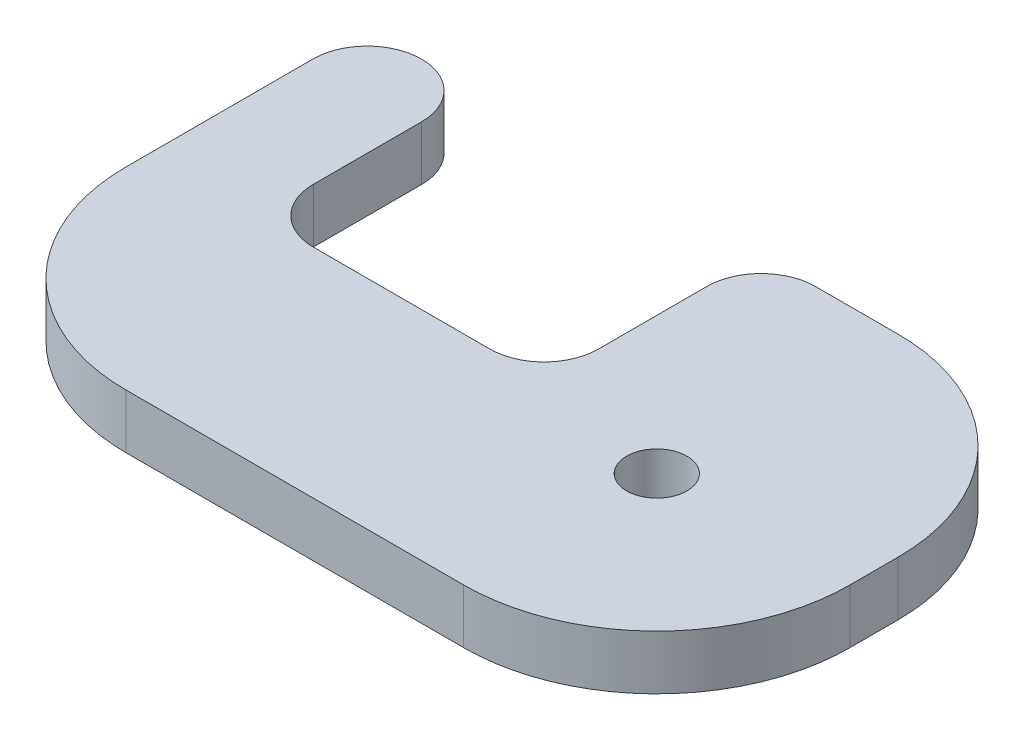
ISO-10303-21;
HEADER;
FILE_DESCRIPTION(('STEP AP214'),'2;1');
FILE_NAME('part.step','',(''),(''),'','','');
FILE_SCHEMA(('AUTOMOTIVE_DESIGN { 1 0 10303 214 1 1 1 1 }'));
ENDSEC;
DATA;
#1=APPLICATION_CONTEXT('core data for automotive mechanical design processes');
#2=APPLICATION_PROTOCOL_DEFINITION('international standard','automotive_design',2000,#1);
#3=PRODUCT_CONTEXT('',#1,'mechanical');
#4=PRODUCT('Part','Part','',(#3));
#5=PRODUCT_RELATED_PRODUCT_CATEGORY('part','',(#4));
#6=PRODUCT_DEFINITION_FORMATION('','',#4);
#7=PRODUCT_DEFINITION_CONTEXT('part definition',#1,'design');
#8=PRODUCT_DEFINITION('design','',#6,#7);
#9=PRODUCT_DEFINITION_SHAPE('','',#8);
#10=(LENGTH_UNIT() NAMED_UNIT(*) SI_UNIT(.MILLI.,.METRE.));
#11=(NAMED_UNIT(*) PLANE_ANGLE_UNIT() SI_UNIT($,.RADIAN.));
#12=(NAMED_UNIT(*) SI_UNIT($,.STERADIAN.) SOLID_ANGLE_UNIT());
#13=UNCERTAINTY_MEASURE_WITH_UNIT(LENGTH_MEASURE(1.E-05),#10,'distance_accuracy_value','');
#14=(GEOMETRIC_REPRESENTATION_CONTEXT(3) GLOBAL_UNCERTAINTY_ASSIGNED_CONTEXT((#13)) GLOBAL_UNIT_ASSIGNED_CONTEXT((#10,
#11,#12)) REPRESENTATION_CONTEXT('',''));
#15=CARTESIAN_POINT('',(0.,0.,0.));
#16=DIRECTION('',(0.,0.,1.));
#17=DIRECTION('',(1.,0.,0.));
#18=AXIS2_PLACEMENT_3D('',#15,#16,#17);
#19=CARTESIAN_POINT('',(0.0610509357311137,3.175,0.0294105912709789));
#20=DIRECTION('',(0.,1.,0.));
#21=DIRECTION('',(0.,0.,1.));
#22=AXIS2_PLACEMENT_3D('',#19,#20,#21);
#23=PLANE('',#22);
#24=CARTESIAN_POINT('',(9.92895093573112,3.175,1.43911059127098));
#25=DIRECTION('',(0.,1.,0.));
#26=DIRECTION('',(0.,0.,1.));
#27=AXIS2_PLACEMENT_3D('',#24,#25,#26);
#28=CIRCLE('',#27,1.762125);
#29=CARTESIAN_POINT('',(9.92895093573112,3.175,3.20123559127098));
#30=VERTEX_POINT('',#29);
#31=EDGE_CURVE('E201',#30,#30,#28,.T.);
#32=ORIENTED_EDGE('',*,*,#31,.F.);
#33=EDGE_LOOP('',(#32));
#34=FACE_BOUND('',#33,.T.);
#35=DIRECTION('',(-1.,0.,0.));
#36=VECTOR('',#35,1.);
#37=CARTESIAN_POINT('',(-21.0844490642689,3.175,-12.657889408729));
#38=LINE('',#37,#36);
#39=CARTESIAN_POINT('',(9.92895093573111,3.175,-12.657889408729));
#40=VERTEX_POINT('',#39);
#41=CARTESIAN_POINT('',(5.10295332629431,3.175,-12.657889408729));
#42=VERTEX_POINT('',#41);
#43=EDGE_CURVE('E197',#40,#42,#38,.T.);
#44=ORIENTED_EDGE('',*,*,#43,.T.);
#45=CARTESIAN_POINT('',(5.10295332629431,3.175,-9.48288940872902));
#46=DIRECTION('',(0.,1.,0.));
#47=DIRECTION('',(0.,0.,1.));
#48=AXIS2_PLACEMENT_3D('',#45,#46,#47);
#49=CIRCLE('',#48,3.175);
#50=CARTESIAN_POINT('',(1.92795332629431,3.175,-9.48288940872902));
#51=VERTEX_POINT('',#50);
#52=EDGE_CURVE('E246',#42,#51,#49,.T.);
#53=ORIENTED_EDGE('',*,*,#52,.T.);
#54=DIRECTION('',(0.,0.,-1.));
#55=VECTOR('',#54,1.);
#56=CARTESIAN_POINT('',(1.92795332629431,3.175,0.0167105912709797));
#57=LINE('',#56,#55);
#58=CARTESIAN_POINT('',(1.92795332629431,3.175,-3.15828940872902));
#59=VERTEX_POINT('',#58);
#60=EDGE_CURVE('E263',#59,#51,#57,.T.);
#61=ORIENTED_EDGE('',*,*,#60,.F.);
#62=CARTESIAN_POINT('',(-1.24704667370569,3.175,-3.15828940872902));
#63=DIRECTION('',(0.,1.,0.));
#64=DIRECTION('',(0.,0.,1.));
#65=AXIS2_PLACEMENT_3D('',#62,#63,#64);
#66=CIRCLE('',#65,3.175);
#67=CARTESIAN_POINT('',(-1.24704667370569,3.175,0.0167105912709797));
#68=VERTEX_POINT('',#67);
#69=EDGE_CURVE('E43',#59,#68,#66,.F.);
#70=ORIENTED_EDGE('',*,*,#69,.T.);
#71=DIRECTION('',(1.,0.,0.));
#72=VECTOR('',#71,1.);
#73=CARTESIAN_POINT('',(-14.7344490642689,3.175,0.0167105912709797));
#74=LINE('',#73,#72);
#75=CARTESIAN_POINT('',(-11.5594490642689,3.175,0.0167105912709797));
#76=VERTEX_POINT('',#75);
#77=EDGE_CURVE('E261',#76,#68,#74,.T.);
#78=ORIENTED_EDGE('',*,*,#77,.F.);
#79=CARTESIAN_POINT('',(-11.5594490642689,3.175,-3.15828940872902));
#80=DIRECTION('',(0.,1.,0.));
#81=DIRECTION('',(0.,0.,1.));
#82=AXIS2_PLACEMENT_3D('',#79,#80,#81);
#83=CIRCLE('',#82,3.175);
#84=CARTESIAN_POINT('',(-14.7344490642689,3.175,-3.15828940872902));
#85=VERTEX_POINT('',#84);
#86=EDGE_CURVE('E254',#76,#85,#83,.F.);
#87=ORIENTED_EDGE('',*,*,#86,.T.);
#88=DIRECTION('',(0.,0.,-1.));
#89=VECTOR('',#88,1.);
#90=CARTESIAN_POINT('',(-14.7344490642689,3.175,0.0167105912709797));
#91=LINE('',#90,#89);
#92=CARTESIAN_POINT('',(-14.7344490642689,3.175,-9.48288940872902));
#93=VERTEX_POINT('',#92);
#94=EDGE_CURVE('E290',#85,#93,#91,.T.);
#95=ORIENTED_EDGE('',*,*,#94,.T.);
#96=CARTESIAN_POINT('',(-17.9094490642689,3.175,-9.48288940872902));
#97=DIRECTION('',(0.,1.,0.));
#98=DIRECTION('',(0.,0.,1.));
#99=AXIS2_PLACEMENT_3D('',#96,#97,#98);
#100=CIRCLE('',#99,3.175);
#101=CARTESIAN_POINT('',(-17.9094490642689,3.175,-12.657889408729));
#102=VERTEX_POINT('',#101);
#103=EDGE_CURVE('E244',#93,#102,#100,.T.);
#104=ORIENTED_EDGE('',*,*,#103,.T.);
#105=CARTESIAN_POINT('',(-17.9094490642689,3.175,-9.48288940872902));
#106=DIRECTION('',(0.,1.,0.));
#107=DIRECTION('',(0.,0.,1.));
#108=AXIS2_PLACEMENT_3D('',#105,#106,#107);
#109=CIRCLE('',#108,3.175);
#110=CARTESIAN_POINT('',(-21.0844490642689,3.175,-9.48288940872902));
#111=VERTEX_POINT('',#110);
#112=EDGE_CURVE('E148',#102,#111,#109,.T.);
#113=ORIENTED_EDGE('',*,*,#112,.T.);
#114=DIRECTION('',(0.,0.,1.));
#115=VECTOR('',#114,1.);
#116=CARTESIAN_POINT('',(-21.0844490642689,3.175,-12.657889408729));
#117=LINE('',#116,#115);
#118=CARTESIAN_POINT('',(-21.0844490642689,3.175,1.43911059127098));
#119=VERTEX_POINT('',#118);
#120=EDGE_CURVE('E140',#111,#119,#117,.T.);
#121=ORIENTED_EDGE('',*,*,#120,.T.);
#122=CARTESIAN_POINT('',(-21.0844490642689,3.175,1.43911059127098));
#123=CARTESIAN_POINT('',(-21.0844490642689,3.175,8.04537572025216));
#124=CARTESIAN_POINT('',(-16.4131141932501,3.175,12.716710591271));
#125=CARTESIAN_POINT('',(-9.80684906426888,3.175,12.716710591271));
#126=(BOUNDED_CURVE() B_SPLINE_CURVE(3,(#122,#123,#124,#125),.UNSPECIFIED.,.F.,
.F.) B_SPLINE_CURVE_WITH_KNOTS((4,4),(0.,1.),
.UNSPECIFIED.) CURVE() GEOMETRIC_REPRESENTATION_ITEM() RATIONAL_B_SPLINE_CURVE((1.,
0.804737854124365,0.804737854124365,1.)) REPRESENTATION_ITEM(''));
#127=CARTESIAN_POINT('',(-9.80684906426888,3.175,12.716710591271));
#128=VERTEX_POINT('',#127);
#129=EDGE_CURVE('E145',#119,#128,#126,.T.);
#130=ORIENTED_EDGE('',*,*,#129,.T.);
#131=DIRECTION('',(1.,0.,0.));
#132=VECTOR('',#131,1.);
#133=CARTESIAN_POINT('',(-21.0844490642689,3.175,12.716710591271));
#134=LINE('',#133,#132);
#135=CARTESIAN_POINT('',(9.92895093573112,3.175,12.716710591271));
#136=VERTEX_POINT('',#135);
#137=EDGE_CURVE('E149',#128,#136,#134,.T.);
#138=ORIENTED_EDGE('',*,*,#137,.T.);
#139=CARTESIAN_POINT('',(9.92895093573112,3.175,12.716710591271));
#140=CARTESIAN_POINT('',(16.5352160647123,3.175,12.716710591271));
#141=CARTESIAN_POINT('',(21.2065509357311,3.175,8.04537572025216));
#142=CARTESIAN_POINT('',(21.2065509357311,3.175,1.43911059127098));
#143=(BOUNDED_CURVE() B_SPLINE_CURVE(3,(#139,#140,#141,#142),.UNSPECIFIED.,.F.,
.F.) B_SPLINE_CURVE_WITH_KNOTS((4,4),(0.,1.),
.UNSPECIFIED.) CURVE() GEOMETRIC_REPRESENTATION_ITEM() RATIONAL_B_SPLINE_CURVE((1.,
0.804737854124365,0.804737854124365,1.)) REPRESENTATION_ITEM(''));
#144=CARTESIAN_POINT('',(21.2065509357311,3.175,1.43911059127098));
#145=VERTEX_POINT('',#144);
#146=EDGE_CURVE('E158',#136,#145,#143,.T.);
#147=ORIENTED_EDGE('',*,*,#146,.T.);
#148=DIRECTION('',(0.,0.,-1.));
#149=VECTOR('',#148,1.);
#150=CARTESIAN_POINT('',(21.2065509357311,3.175,-12.657889408729));
#151=LINE('',#150,#149);
#152=CARTESIAN_POINT('',(21.2065509357311,3.175,-1.38028940872902));
#153=VERTEX_POINT('',#152);
#154=EDGE_CURVE('E182',#145,#153,#151,.T.);
#155=ORIENTED_EDGE('',*,*,#154,.T.);
#156=CARTESIAN_POINT('',(21.2065509357311,3.175,-1.38028940872902));
#157=CARTESIAN_POINT('',(21.2065509357311,3.175,-7.98655453771021));
#158=CARTESIAN_POINT('',(16.5352160647123,3.175,-12.657889408729));
#159=CARTESIAN_POINT('',(9.92895093573111,3.175,-12.657889408729));
#160=(BOUNDED_CURVE() B_SPLINE_CURVE(3,(#156,#157,#158,#159),.UNSPECIFIED.,.F.,
.F.) B_SPLINE_CURVE_WITH_KNOTS((4,4),(0.,1.),
.UNSPECIFIED.) CURVE() GEOMETRIC_REPRESENTATION_ITEM() RATIONAL_B_SPLINE_CURVE((1.,
0.804737854124365,0.804737854124365,1.)) REPRESENTATION_ITEM(''));
#161=EDGE_CURVE('E175',#153,#40,#160,.T.);
#162=ORIENTED_EDGE('',*,*,#161,.T.);
#163=EDGE_LOOP('',(#44,#53,#61,#70,#78,#87,#95,#104,#113,#121,#130,#138,#147,#155,#162));
#164=FACE_BOUND('',#163,.T.);
#165=ADVANCED_FACE('F34',(#34,#164),#23,.T.);
#166=CARTESIAN_POINT('',(0.0610509357311137,0.,0.0294105912709789));
#167=DIRECTION('',(0.,1.,0.));
#168=DIRECTION('',(0.,0.,1.));
#169=AXIS2_PLACEMENT_3D('',#166,#167,#168);
#170=PLANE('',#169);
#171=CARTESIAN_POINT('',(9.92895093573112,0.,1.43911059127098));
#172=DIRECTION('',(0.,1.,0.));
#173=DIRECTION('',(0.,0.,1.));
#174=AXIS2_PLACEMENT_3D('',#171,#172,#173);
#175=CIRCLE('',#174,1.762125);
#176=CARTESIAN_POINT('',(9.92895093573112,0.,3.20123559127098));
#177=VERTEX_POINT('',#176);
#178=EDGE_CURVE('E198',#177,#177,#175,.T.);
#179=ORIENTED_EDGE('',*,*,#178,.T.);
#180=EDGE_LOOP('',(#179));
#181=FACE_BOUND('',#180,.T.);
#182=DIRECTION('',(0.,0.,-1.));
#183=VECTOR('',#182,1.);
#184=CARTESIAN_POINT('',(1.92795332629431,0.,0.0167105912709797));
#185=LINE('',#184,#183);
#186=CARTESIAN_POINT('',(1.92795332629431,0.,-3.15828940872902));
#187=VERTEX_POINT('',#186);
#188=CARTESIAN_POINT('',(1.92795332629431,0.,-9.48288940872902));
#189=VERTEX_POINT('',#188);
#190=EDGE_CURVE('E279',#187,#189,#185,.T.);
#191=ORIENTED_EDGE('',*,*,#190,.T.);
#192=CARTESIAN_POINT('',(5.10295332629431,0.,-9.48288940872902));
#193=DIRECTION('',(0.,1.,0.));
#194=DIRECTION('',(0.,0.,1.));
#195=AXIS2_PLACEMENT_3D('',#192,#193,#194);
#196=CIRCLE('',#195,3.175);
#197=CARTESIAN_POINT('',(5.10295332629431,0.,-12.657889408729));
#198=VERTEX_POINT('',#197);
#199=EDGE_CURVE('E251',#189,#198,#196,.F.);
#200=ORIENTED_EDGE('',*,*,#199,.T.);
#201=DIRECTION('',(-1.,0.,0.));
#202=VECTOR('',#201,1.);
#203=CARTESIAN_POINT('',(-21.0844490642689,0.,-12.657889408729));
#204=LINE('',#203,#202);
#205=CARTESIAN_POINT('',(9.92895093573111,0.,-12.657889408729));
#206=VERTEX_POINT('',#205);
#207=EDGE_CURVE('E150',#206,#198,#204,.T.);
#208=ORIENTED_EDGE('',*,*,#207,.F.);
#209=CARTESIAN_POINT('',(21.2065509357311,0.,-1.38028940872902));
#210=CARTESIAN_POINT('',(21.2065509357311,0.,-7.98655453771021));
#211=CARTESIAN_POINT('',(16.5352160647123,0.,-12.657889408729));
#212=CARTESIAN_POINT('',(9.92895093573111,0.,-12.657889408729));
#213=(BOUNDED_CURVE() B_SPLINE_CURVE(3,(#209,#210,#211,#212),.UNSPECIFIED.,.F.,
.F.) B_SPLINE_CURVE_WITH_KNOTS((4,4),(0.,1.),
.UNSPECIFIED.) CURVE() GEOMETRIC_REPRESENTATION_ITEM() RATIONAL_B_SPLINE_CURVE((1.,
0.804737854124365,0.804737854124365,1.)) REPRESENTATION_ITEM(''));
#214=CARTESIAN_POINT('',(21.2065509357311,0.,-1.38028940872902));
#215=VERTEX_POINT('',#214);
#216=EDGE_CURVE('E202',#206,#215,#213,.F.);
#217=ORIENTED_EDGE('',*,*,#216,.T.);
#218=DIRECTION('',(0.,0.,-1.));
#219=VECTOR('',#218,1.);
#220=CARTESIAN_POINT('',(21.2065509357311,0.,-12.657889408729));
#221=LINE('',#220,#219);
#222=CARTESIAN_POINT('',(21.2065509357311,0.,1.43911059127098));
#223=VERTEX_POINT('',#222);
#224=EDGE_CURVE('E195',#223,#215,#221,.T.);
#225=ORIENTED_EDGE('',*,*,#224,.F.);
#226=CARTESIAN_POINT('',(9.92895093573112,0.,12.716710591271));
#227=CARTESIAN_POINT('',(16.5352160647123,0.,12.716710591271));
#228=CARTESIAN_POINT('',(21.2065509357311,0.,8.04537572025216));
#229=CARTESIAN_POINT('',(21.2065509357311,0.,1.43911059127098));
#230=(BOUNDED_CURVE() B_SPLINE_CURVE(3,(#226,#227,#228,#229),.UNSPECIFIED.,.F.,
.F.) B_SPLINE_CURVE_WITH_KNOTS((4,4),(0.,1.),
.UNSPECIFIED.) CURVE() GEOMETRIC_REPRESENTATION_ITEM() RATIONAL_B_SPLINE_CURVE((1.,
0.804737854124365,0.804737854124365,1.)) REPRESENTATION_ITEM(''));
#231=CARTESIAN_POINT('',(9.92895093573112,0.,12.716710591271));
#232=VERTEX_POINT('',#231);
#233=EDGE_CURVE('E190',#223,#232,#230,.F.);
#234=ORIENTED_EDGE('',*,*,#233,.T.);
#235=DIRECTION('',(1.,0.,0.));
#236=VECTOR('',#235,1.);
#237=CARTESIAN_POINT('',(-21.0844490642689,0.,12.716710591271));
#238=LINE('',#237,#236);
#239=CARTESIAN_POINT('',(-9.80684906426888,0.,12.716710591271));
#240=VERTEX_POINT('',#239);
#241=EDGE_CURVE('E192',#240,#232,#238,.T.);
#242=ORIENTED_EDGE('',*,*,#241,.F.);
#243=CARTESIAN_POINT('',(-21.0844490642689,0.,1.43911059127098));
#244=CARTESIAN_POINT('',(-21.0844490642689,0.,8.04537572025216));
#245=CARTESIAN_POINT('',(-16.4131141932501,0.,12.716710591271));
#246=CARTESIAN_POINT('',(-9.80684906426888,0.,12.716710591271));
#247=(BOUNDED_CURVE() B_SPLINE_CURVE(3,(#243,#244,#245,#246),.UNSPECIFIED.,.F.,
.F.) B_SPLINE_CURVE_WITH_KNOTS((4,4),(0.,1.),
.UNSPECIFIED.) CURVE() GEOMETRIC_REPRESENTATION_ITEM() RATIONAL_B_SPLINE_CURVE((1.,
0.804737854124365,0.804737854124365,1.)) REPRESENTATION_ITEM(''));
#248=CARTESIAN_POINT('',(-21.0844490642689,0.,1.43911059127098));
#249=VERTEX_POINT('',#248);
#250=EDGE_CURVE('E159',#240,#249,#247,.F.);
#251=ORIENTED_EDGE('',*,*,#250,.T.);
#252=DIRECTION('',(0.,0.,1.));
#253=VECTOR('',#252,1.);
#254=CARTESIAN_POINT('',(-21.0844490642689,0.,-12.657889408729));
#255=LINE('',#254,#253);
#256=CARTESIAN_POINT('',(-21.0844490642689,0.,-9.48288940872902));
#257=VERTEX_POINT('',#256);
#258=EDGE_CURVE('E155',#257,#249,#255,.T.);
#259=ORIENTED_EDGE('',*,*,#258,.F.);
#260=CARTESIAN_POINT('',(-17.9094490642689,0.,-9.48288940872902));
#261=DIRECTION('',(0.,1.,0.));
#262=DIRECTION('',(0.,0.,1.));
#263=AXIS2_PLACEMENT_3D('',#260,#261,#262);
#264=CIRCLE('',#263,3.175);
#265=CARTESIAN_POINT('',(-17.9094490642689,0.,-12.657889408729));
#266=VERTEX_POINT('',#265);
#267=EDGE_CURVE('E50',#257,#266,#264,.F.);
#268=ORIENTED_EDGE('',*,*,#267,.T.);
#269=CARTESIAN_POINT('',(-17.9094490642689,0.,-9.48288940872902));
#270=DIRECTION('',(0.,1.,0.));
#271=DIRECTION('',(0.,0.,1.));
#272=AXIS2_PLACEMENT_3D('',#269,#270,#271);
#273=CIRCLE('',#272,3.175);
#274=CARTESIAN_POINT('',(-14.7344490642689,0.,-9.48288940872902));
#275=VERTEX_POINT('',#274);
#276=EDGE_CURVE('E249',#266,#275,#273,.F.);
#277=ORIENTED_EDGE('',*,*,#276,.T.);
#278=DIRECTION('',(0.,0.,-1.));
#279=VECTOR('',#278,1.);
#280=CARTESIAN_POINT('',(-14.7344490642689,0.,0.0167105912709797));
#281=LINE('',#280,#279);
#282=CARTESIAN_POINT('',(-14.7344490642689,0.,-3.15828940872902));
#283=VERTEX_POINT('',#282);
#284=EDGE_CURVE('E272',#283,#275,#281,.T.);
#285=ORIENTED_EDGE('',*,*,#284,.F.);
#286=CARTESIAN_POINT('',(-11.5594490642689,0.,-3.15828940872902));
#287=DIRECTION('',(0.,1.,0.));
#288=DIRECTION('',(0.,0.,1.));
#289=AXIS2_PLACEMENT_3D('',#286,#287,#288);
#290=CIRCLE('',#289,3.175);
#291=CARTESIAN_POINT('',(-11.5594490642689,0.,0.0167105912709797));
#292=VERTEX_POINT('',#291);
#293=EDGE_CURVE('E256',#283,#292,#290,.T.);
#294=ORIENTED_EDGE('',*,*,#293,.T.);
#295=DIRECTION('',(1.,0.,0.));
#296=VECTOR('',#295,1.);
#297=CARTESIAN_POINT('',(-14.7344490642689,0.,0.0167105912709797));
#298=LINE('',#297,#296);
#299=CARTESIAN_POINT('',(-1.24704667370569,0.,0.0167105912709797));
#300=VERTEX_POINT('',#299);
#301=EDGE_CURVE('E281',#292,#300,#298,.T.);
#302=ORIENTED_EDGE('',*,*,#301,.T.);
#303=CARTESIAN_POINT('',(-1.24704667370569,0.,-3.15828940872902));
#304=DIRECTION('',(0.,1.,0.));
#305=DIRECTION('',(0.,0.,1.));
#306=AXIS2_PLACEMENT_3D('',#303,#304,#305);
#307=CIRCLE('',#306,3.175);
#308=EDGE_CURVE('E11',#300,#187,#307,.T.);
#309=ORIENTED_EDGE('',*,*,#308,.T.);
#310=EDGE_LOOP('',(#191,#200,#208,#217,#225,#234,#242,#251,#259,#268,#277,#285,#294,#302,#309));
#311=FACE_BOUND('',#310,.T.);
#312=ADVANCED_FACE('F278',(#181,#311),#170,.F.);
#313=CARTESIAN_POINT('',(-21.0844490642689,3.175,-12.657889408729));
#314=DIRECTION('',(1.,0.,0.));
#315=DIRECTION('',(0.,0.,-1.));
#316=AXIS2_PLACEMENT_3D('',#313,#314,#315);
#317=PLANE('',#316);
#318=ORIENTED_EDGE('',*,*,#120,.F.);
#319=DIRECTION('',(0.,-1.,0.));
#320=VECTOR('',#319,1.);
#321=CARTESIAN_POINT('',(-21.0844490642689,3.175,-9.48288940872902));
#322=LINE('',#321,#320);
#323=EDGE_CURVE('E58',#111,#257,#322,.T.);
#324=ORIENTED_EDGE('',*,*,#323,.T.);
#325=ORIENTED_EDGE('',*,*,#258,.T.);
#326=DIRECTION('',(0.,-1.,0.));
#327=VECTOR('',#326,1.);
#328=CARTESIAN_POINT('',(-21.0844490642689,3.175,1.43911059127098));
#329=LINE('',#328,#327);
#330=EDGE_CURVE('E153',#249,#119,#329,.F.);
#331=ORIENTED_EDGE('',*,*,#330,.T.);
#332=EDGE_LOOP('',(#318,#324,#325,#331));
#333=FACE_BOUND('',#332,.T.);
#334=ADVANCED_FACE('F154',(#333),#317,.F.);
#335=CARTESIAN_POINT('',(-21.0844490642689,3.175,12.716710591271));
#336=DIRECTION('',(0.,0.,-1.));
#337=DIRECTION('',(-1.,0.,0.));
#338=AXIS2_PLACEMENT_3D('',#335,#336,#337);
#339=PLANE('',#338);
#340=ORIENTED_EDGE('',*,*,#137,.F.);
#341=DIRECTION('',(0.,-1.,0.));
#342=VECTOR('',#341,1.);
#343=CARTESIAN_POINT('',(-9.80684906426888,3.175,12.716710591271));
#344=LINE('',#343,#342);
#345=EDGE_CURVE('E164',#128,#240,#344,.T.);
#346=ORIENTED_EDGE('',*,*,#345,.T.);
#347=ORIENTED_EDGE('',*,*,#241,.T.);
#348=DIRECTION('',(0.,-1.,0.));
#349=VECTOR('',#348,1.);
#350=CARTESIAN_POINT('',(9.92895093573112,3.175,12.716710591271));
#351=LINE('',#350,#349);
#352=EDGE_CURVE('E191',#232,#136,#351,.F.);
#353=ORIENTED_EDGE('',*,*,#352,.T.);
#354=EDGE_LOOP('',(#340,#346,#347,#353));
#355=FACE_BOUND('',#354,.T.);
#356=ADVANCED_FACE('F433',(#355),#339,.F.);
#357=CARTESIAN_POINT('',(21.2065509357311,3.175,-12.657889408729));
#358=DIRECTION('',(-1.,0.,0.));
#359=DIRECTION('',(0.,0.,1.));
#360=AXIS2_PLACEMENT_3D('',#357,#358,#359);
#361=PLANE('',#360);
#362=ORIENTED_EDGE('',*,*,#224,.T.);
#363=DIRECTION('',(0.,-1.,0.));
#364=VECTOR('',#363,1.);
#365=CARTESIAN_POINT('',(21.2065509357311,3.175,-1.38028940872902));
#366=LINE('',#365,#364);
#367=EDGE_CURVE('E206',#215,#153,#366,.F.);
#368=ORIENTED_EDGE('',*,*,#367,.T.);
#369=ORIENTED_EDGE('',*,*,#154,.F.);
#370=DIRECTION('',(0.,-1.,0.));
#371=VECTOR('',#370,1.);
#372=CARTESIAN_POINT('',(21.2065509357311,3.175,1.43911059127098));
#373=LINE('',#372,#371);
#374=EDGE_CURVE('E165',#145,#223,#373,.T.);
#375=ORIENTED_EDGE('',*,*,#374,.T.);
#376=EDGE_LOOP('',(#362,#368,#369,#375));
#377=FACE_BOUND('',#376,.T.);
#378=ADVANCED_FACE('F422',(#377),#361,.F.);
#379=CARTESIAN_POINT('',(-21.0844490642689,3.175,-12.657889408729));
#380=DIRECTION('',(0.,0.,1.));
#381=DIRECTION('',(1.,0.,0.));
#382=AXIS2_PLACEMENT_3D('',#379,#380,#381);
#383=PLANE('',#382);
#384=ORIENTED_EDGE('',*,*,#207,.T.);
#385=DIRECTION('',(0.,1.,0.));
#386=VECTOR('',#385,1.);
#387=CARTESIAN_POINT('',(5.10295332629431,3.175,-12.657889408729));
#388=LINE('',#387,#386);
#389=EDGE_CURVE('E240',#198,#42,#388,.T.);
#390=ORIENTED_EDGE('',*,*,#389,.T.);
#391=ORIENTED_EDGE('',*,*,#43,.F.);
#392=DIRECTION('',(0.,-1.,0.));
#393=VECTOR('',#392,1.);
#394=CARTESIAN_POINT('',(9.92895093573112,3.175,-12.657889408729));
#395=LINE('',#394,#393);
#396=EDGE_CURVE('E168',#40,#206,#395,.T.);
#397=ORIENTED_EDGE('',*,*,#396,.T.);
#398=EDGE_LOOP('',(#384,#390,#391,#397));
#399=FACE_BOUND('',#398,.T.);
#400=ADVANCED_FACE('F314',(#399),#383,.F.);
#401=CARTESIAN_POINT('',(-9.80684906426888,3.175,1.43911059127098));
#402=DIRECTION('',(0.,-1.,0.));
#403=DIRECTION('',(0.,0.,-1.));
#404=AXIS2_PLACEMENT_3D('',#401,#402,#403);
#405=CYLINDRICAL_SURFACE('',#404,11.2776);
#406=ORIENTED_EDGE('',*,*,#129,.F.);
#407=ORIENTED_EDGE('',*,*,#330,.F.);
#408=ORIENTED_EDGE('',*,*,#250,.F.);
#409=ORIENTED_EDGE('',*,*,#345,.F.);
#410=EDGE_LOOP('',(#406,#407,#408,#409));
#411=FACE_BOUND('',#410,.T.);
#412=ADVANCED_FACE('F162',(#411),#405,.T.);
#413=CARTESIAN_POINT('',(9.92895093573112,3.175,1.43911059127098));
#414=DIRECTION('',(0.,-1.,0.));
#415=DIRECTION('',(0.,0.,-1.));
#416=AXIS2_PLACEMENT_3D('',#413,#414,#415);
#417=CYLINDRICAL_SURFACE('',#416,11.2776);
#418=ORIENTED_EDGE('',*,*,#146,.F.);
#419=ORIENTED_EDGE('',*,*,#352,.F.);
#420=ORIENTED_EDGE('',*,*,#233,.F.);
#421=ORIENTED_EDGE('',*,*,#374,.F.);
#422=EDGE_LOOP('',(#418,#419,#420,#421));
#423=FACE_BOUND('',#422,.T.);
#424=ADVANCED_FACE('F343',(#423),#417,.T.);
#425=CARTESIAN_POINT('',(9.92895093573112,0.,1.43911059127098));
#426=DIRECTION('',(0.,1.,0.));
#427=DIRECTION('',(0.,0.,1.));
#428=AXIS2_PLACEMENT_3D('',#425,#426,#427);
#429=CYLINDRICAL_SURFACE('',#428,1.762125);
#430=ORIENTED_EDGE('',*,*,#178,.F.);
#431=EDGE_LOOP('',(#430));
#432=FACE_BOUND('',#431,.T.);
#433=ORIENTED_EDGE('',*,*,#31,.T.);
#434=EDGE_LOOP('',(#433));
#435=FACE_BOUND('',#434,.T.);
#436=ADVANCED_FACE('F346',(#432,#435),#429,.F.);
#437=CARTESIAN_POINT('',(9.92895093573112,3.175,-1.38028940872902));
#438=DIRECTION('',(0.,-1.,0.));
#439=DIRECTION('',(0.,0.,-1.));
#440=AXIS2_PLACEMENT_3D('',#437,#438,#439);
#441=CYLINDRICAL_SURFACE('',#440,11.2776);
#442=ORIENTED_EDGE('',*,*,#161,.F.);
#443=ORIENTED_EDGE('',*,*,#367,.F.);
#444=ORIENTED_EDGE('',*,*,#216,.F.);
#445=ORIENTED_EDGE('',*,*,#396,.F.);
#446=EDGE_LOOP('',(#442,#443,#444,#445));
#447=FACE_BOUND('',#446,.T.);
#448=ADVANCED_FACE('F311',(#447),#441,.T.);
#449=CARTESIAN_POINT('',(-14.7344490642689,0.,0.0167105912709797));
#450=DIRECTION('',(1.,0.,0.));
#451=DIRECTION('',(0.,0.,-1.));
#452=AXIS2_PLACEMENT_3D('',#449,#450,#451);
#453=PLANE('',#452);
#454=ORIENTED_EDGE('',*,*,#94,.F.);
#455=DIRECTION('',(0.,1.,0.));
#456=VECTOR('',#455,1.);
#457=CARTESIAN_POINT('',(-14.7344490642689,0.,-3.15828940872902));
#458=LINE('',#457,#456);
#459=EDGE_CURVE('E233',#85,#283,#458,.F.);
#460=ORIENTED_EDGE('',*,*,#459,.T.);
#461=ORIENTED_EDGE('',*,*,#284,.T.);
#462=DIRECTION('',(0.,1.,0.));
#463=VECTOR('',#462,1.);
#464=CARTESIAN_POINT('',(-14.7344490642689,3.175,-9.48288940872902));
#465=LINE('',#464,#463);
#466=EDGE_CURVE('E230',#275,#93,#465,.T.);
#467=ORIENTED_EDGE('',*,*,#466,.T.);
#468=EDGE_LOOP('',(#454,#460,#461,#467));
#469=FACE_BOUND('',#468,.T.);
#470=ADVANCED_FACE('F353',(#469),#453,.T.);
#471=CARTESIAN_POINT('',(1.92795332629431,0.,0.0167105912709797));
#472=DIRECTION('',(1.,0.,0.));
#473=DIRECTION('',(0.,0.,-1.));
#474=AXIS2_PLACEMENT_3D('',#471,#472,#473);
#475=PLANE('',#474);
#476=ORIENTED_EDGE('',*,*,#190,.F.);
#477=DIRECTION('',(0.,1.,0.));
#478=VECTOR('',#477,1.);
#479=CARTESIAN_POINT('',(1.92795332629431,3.175,-3.15828940872902));
#480=LINE('',#479,#478);
#481=EDGE_CURVE('E237',#187,#59,#480,.T.);
#482=ORIENTED_EDGE('',*,*,#481,.T.);
#483=ORIENTED_EDGE('',*,*,#60,.T.);
#484=DIRECTION('',(0.,1.,0.));
#485=VECTOR('',#484,1.);
#486=CARTESIAN_POINT('',(1.92795332629431,0.,-9.48288940872902));
#487=LINE('',#486,#485);
#488=EDGE_CURVE('E235',#51,#189,#487,.F.);
#489=ORIENTED_EDGE('',*,*,#488,.T.);
#490=EDGE_LOOP('',(#476,#482,#483,#489));
#491=FACE_BOUND('',#490,.T.);
#492=ADVANCED_FACE('F283',(#491),#475,.F.);
#493=CARTESIAN_POINT('',(-14.7344490642689,0.,0.0167105912709797));
#494=DIRECTION('',(0.,0.,1.));
#495=DIRECTION('',(1.,0.,0.));
#496=AXIS2_PLACEMENT_3D('',#493,#494,#495);
#497=PLANE('',#496);
#498=ORIENTED_EDGE('',*,*,#301,.F.);
#499=DIRECTION('',(0.,1.,0.));
#500=VECTOR('',#499,1.);
#501=CARTESIAN_POINT('',(-11.5594490642689,0.,0.0167105912709797));
#502=LINE('',#501,#500);
#503=EDGE_CURVE('E227',#292,#76,#502,.T.);
#504=ORIENTED_EDGE('',*,*,#503,.T.);
#505=ORIENTED_EDGE('',*,*,#77,.T.);
#506=DIRECTION('',(0.,1.,0.));
#507=VECTOR('',#506,1.);
#508=CARTESIAN_POINT('',(-1.24704667370569,0.,0.0167105912709797));
#509=LINE('',#508,#507);
#510=EDGE_CURVE('E225',#68,#300,#509,.F.);
#511=ORIENTED_EDGE('',*,*,#510,.T.);
#512=EDGE_LOOP('',(#498,#504,#505,#511));
#513=FACE_BOUND('',#512,.T.);
#514=ADVANCED_FACE('F269',(#513),#497,.F.);
#515=CARTESIAN_POINT('',(-11.5594490642689,0.,-3.15828940872902));
#516=DIRECTION('',(0.,1.,0.));
#517=DIRECTION('',(0.,0.,1.));
#518=AXIS2_PLACEMENT_3D('',#515,#516,#517);
#519=CYLINDRICAL_SURFACE('',#518,3.175);
#520=ORIENTED_EDGE('',*,*,#293,.F.);
#521=ORIENTED_EDGE('',*,*,#459,.F.);
#522=ORIENTED_EDGE('',*,*,#86,.F.);
#523=ORIENTED_EDGE('',*,*,#503,.F.);
#524=EDGE_LOOP('',(#520,#521,#522,#523));
#525=FACE_BOUND('',#524,.T.);
#526=ADVANCED_FACE('F327',(#525),#519,.F.);
#527=CARTESIAN_POINT('',(-1.24704667370569,0.,-3.15828940872902));
#528=DIRECTION('',(0.,-1.,0.));
#529=DIRECTION('',(0.,0.,-1.));
#530=AXIS2_PLACEMENT_3D('',#527,#528,#529);
#531=CYLINDRICAL_SURFACE('',#530,3.175);
#532=ORIENTED_EDGE('',*,*,#308,.F.);
#533=ORIENTED_EDGE('',*,*,#510,.F.);
#534=ORIENTED_EDGE('',*,*,#69,.F.);
#535=ORIENTED_EDGE('',*,*,#481,.F.);
#536=EDGE_LOOP('',(#532,#533,#534,#535));
#537=FACE_BOUND('',#536,.T.);
#538=ADVANCED_FACE('F275',(#537),#531,.F.);
#539=CARTESIAN_POINT('',(5.10295332629431,3.175,-9.48288940872902));
#540=DIRECTION('',(0.,1.,0.));
#541=DIRECTION('',(0.,0.,1.));
#542=AXIS2_PLACEMENT_3D('',#539,#540,#541);
#543=CYLINDRICAL_SURFACE('',#542,3.175);
#544=ORIENTED_EDGE('',*,*,#199,.F.);
#545=ORIENTED_EDGE('',*,*,#488,.F.);
#546=ORIENTED_EDGE('',*,*,#52,.F.);
#547=ORIENTED_EDGE('',*,*,#389,.F.);
#548=EDGE_LOOP('',(#544,#545,#546,#547));
#549=FACE_BOUND('',#548,.T.);
#550=ADVANCED_FACE('F318',(#549),#543,.T.);
#551=CARTESIAN_POINT('',(-17.9094490642689,3.175,-9.48288940872902));
#552=DIRECTION('',(0.,-1.,0.));
#553=DIRECTION('',(0.,0.,-1.));
#554=AXIS2_PLACEMENT_3D('',#551,#552,#553);
#555=CYLINDRICAL_SURFACE('',#554,3.175);
#556=DIRECTION('',(0.,-1.,0.));
#557=VECTOR('',#556,1.);
#558=CARTESIAN_POINT('',(-17.9094490642689,3.175,-12.657889408729));
#559=LINE('',#558,#557);
#560=EDGE_CURVE('E38',#266,#102,#559,.F.);
#561=ORIENTED_EDGE('',*,*,#560,.F.);
#562=ORIENTED_EDGE('',*,*,#267,.F.);
#563=ORIENTED_EDGE('',*,*,#323,.F.);
#564=ORIENTED_EDGE('',*,*,#112,.F.);
#565=EDGE_LOOP('',(#561,#562,#563,#564));
#566=FACE_BOUND('',#565,.T.);
#567=ADVANCED_FACE('F36',(#566),#555,.T.);
#568=CARTESIAN_POINT('',(-17.9094490642689,0.,-9.48288940872902));
#569=DIRECTION('',(0.,-1.,0.));
#570=DIRECTION('',(0.,0.,-1.));
#571=AXIS2_PLACEMENT_3D('',#568,#569,#570);
#572=CYLINDRICAL_SURFACE('',#571,3.175);
#573=ORIENTED_EDGE('',*,*,#276,.F.);
#574=ORIENTED_EDGE('',*,*,#560,.T.);
#575=ORIENTED_EDGE('',*,*,#103,.F.);
#576=ORIENTED_EDGE('',*,*,#466,.F.);
#577=EDGE_LOOP('',(#573,#574,#575,#576));
#578=FACE_BOUND('',#577,.T.);
#579=ADVANCED_FACE('F325',(#578),#572,.T.);
#580=CLOSED_SHELL('',(#165,#312,#334,#356,#378,#400,#412,#424,#436,#448,#470,#492,#514,#526,
#538,#550,#567,#579));
#581=MANIFOLD_SOLID_BREP('B2',#580);
#582=ADVANCED_BREP_SHAPE_REPRESENTATION('',(#18,#581),#14);
#583=SHAPE_DEFINITION_REPRESENTATION(#9,#582);
ENDSEC;
END-ISO-10303-21;
